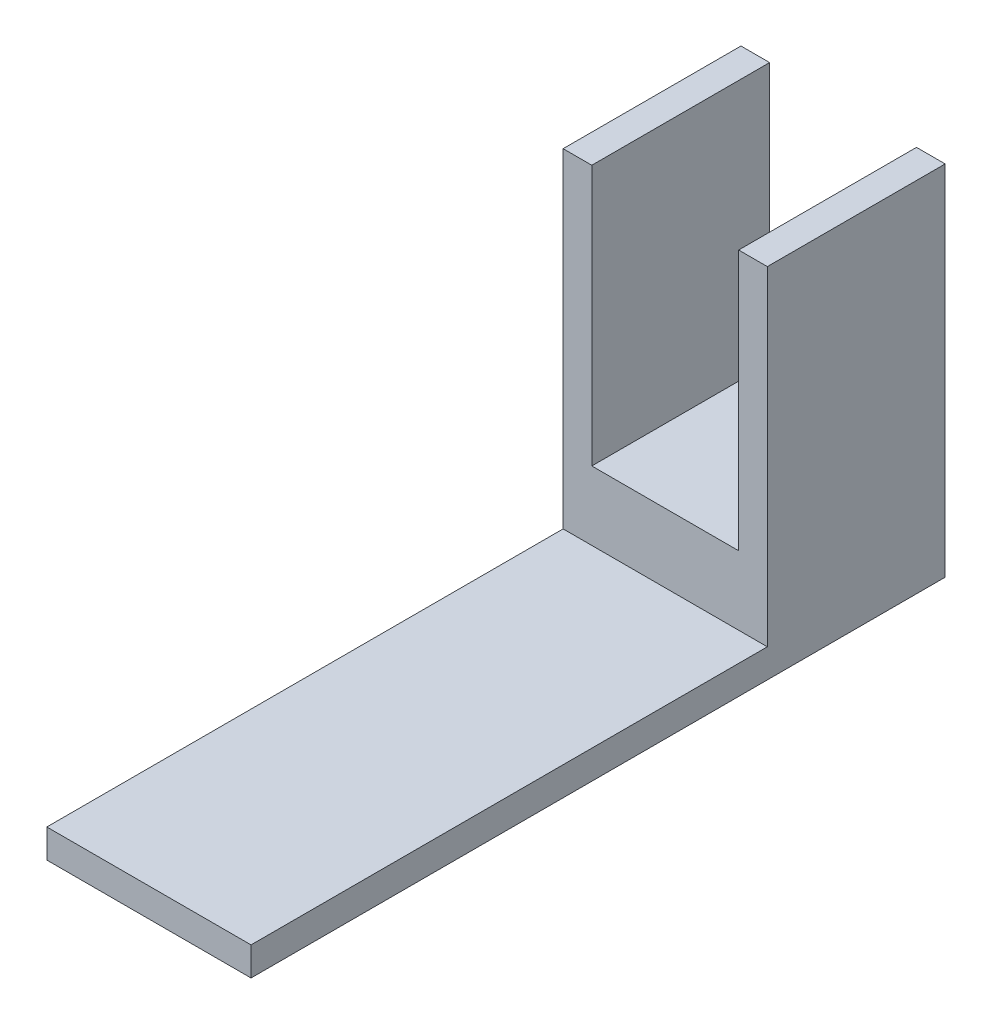
ISO-10303-21;
HEADER;
FILE_DESCRIPTION(('STEP AP214'),'2;1');
FILE_NAME('part.step','',(''),(''),'','','');
FILE_SCHEMA(('AUTOMOTIVE_DESIGN { 1 0 10303 214 1 1 1 1 }'));
ENDSEC;
DATA;
#1=APPLICATION_CONTEXT('core data for automotive mechanical design processes');
#2=APPLICATION_PROTOCOL_DEFINITION('international standard','automotive_design',2000,#1);
#3=PRODUCT_CONTEXT('',#1,'mechanical');
#4=PRODUCT('Part','Part','',(#3));
#5=PRODUCT_RELATED_PRODUCT_CATEGORY('part','',(#4));
#6=PRODUCT_DEFINITION_FORMATION('','',#4);
#7=PRODUCT_DEFINITION_CONTEXT('part definition',#1,'design');
#8=PRODUCT_DEFINITION('design','',#6,#7);
#9=PRODUCT_DEFINITION_SHAPE('','',#8);
#10=(LENGTH_UNIT() NAMED_UNIT(*) SI_UNIT(.MILLI.,.METRE.));
#11=(NAMED_UNIT(*) PLANE_ANGLE_UNIT() SI_UNIT($,.RADIAN.));
#12=(NAMED_UNIT(*) SI_UNIT($,.STERADIAN.) SOLID_ANGLE_UNIT());
#13=UNCERTAINTY_MEASURE_WITH_UNIT(LENGTH_MEASURE(1.E-05),#10,'distance_accuracy_value','');
#14=(GEOMETRIC_REPRESENTATION_CONTEXT(3) GLOBAL_UNCERTAINTY_ASSIGNED_CONTEXT((#13)) GLOBAL_UNIT_ASSIGNED_CONTEXT((#10,
#11,#12)) REPRESENTATION_CONTEXT('',''));
#15=CARTESIAN_POINT('',(0.,0.,0.));
#16=DIRECTION('',(0.,0.,1.));
#17=DIRECTION('',(1.,0.,0.));
#18=AXIS2_PLACEMENT_3D('',#15,#16,#17);
#19=CARTESIAN_POINT('',(0.,-4.,-15.5));
#20=DIRECTION('',(0.,0.,-1.));
#21=DIRECTION('',(-1.,0.,0.));
#22=AXIS2_PLACEMENT_3D('',#19,#20,#21);
#23=PLANE('',#22);
#24=DIRECTION('',(0.,1.,0.));
#25=VECTOR('',#24,1.);
#26=CARTESIAN_POINT('',(15.3,0.,-15.5));
#27=LINE('',#26,#25);
#28=CARTESIAN_POINT('',(15.3,-6.5,-15.5));
#29=VERTEX_POINT('',#28);
#30=CARTESIAN_POINT('',(15.3,24.7,-15.5));
#31=VERTEX_POINT('',#30);
#32=EDGE_CURVE('E235',#29,#31,#27,.T.);
#33=ORIENTED_EDGE('',*,*,#32,.F.);
#34=DIRECTION('',(1.,0.,0.));
#35=VECTOR('',#34,1.);
#36=CARTESIAN_POINT('',(15.3,-6.5,-15.5));
#37=LINE('',#36,#35);
#38=CARTESIAN_POINT('',(-2.49999999999999,-6.5,-15.5));
#39=VERTEX_POINT('',#38);
#40=EDGE_CURVE('E139',#39,#29,#37,.T.);
#41=ORIENTED_EDGE('',*,*,#40,.F.);
#42=DIRECTION('',(0.,-1.,0.));
#43=VECTOR('',#42,1.);
#44=CARTESIAN_POINT('',(-2.5,0.,-15.5));
#45=LINE('',#44,#43);
#46=CARTESIAN_POINT('',(-2.5,24.7,-15.5));
#47=VERTEX_POINT('',#46);
#48=EDGE_CURVE('E178',#47,#39,#45,.T.);
#49=ORIENTED_EDGE('',*,*,#48,.F.);
#50=DIRECTION('',(1.,0.,0.));
#51=VECTOR('',#50,1.);
#52=CARTESIAN_POINT('',(-2.5,24.7,-15.5));
#53=LINE('',#52,#51);
#54=CARTESIAN_POINT('',(0.,24.7,-15.5));
#55=VERTEX_POINT('',#54);
#56=EDGE_CURVE('E244',#47,#55,#53,.T.);
#57=ORIENTED_EDGE('',*,*,#56,.T.);
#58=DIRECTION('',(0.,-1.,0.));
#59=VECTOR('',#58,1.);
#60=CARTESIAN_POINT('',(0.,0.,-15.5));
#61=LINE('',#60,#59);
#62=CARTESIAN_POINT('',(0.,2.,-15.5));
#63=VERTEX_POINT('',#62);
#64=EDGE_CURVE('E177',#55,#63,#61,.T.);
#65=ORIENTED_EDGE('',*,*,#64,.T.);
#66=DIRECTION('',(-1.,0.,0.));
#67=VECTOR('',#66,1.);
#68=CARTESIAN_POINT('',(0.,2.,-15.5));
#69=LINE('',#68,#67);
#70=CARTESIAN_POINT('',(12.8,2.,-15.5));
#71=VERTEX_POINT('',#70);
#72=EDGE_CURVE('E49',#71,#63,#69,.T.);
#73=ORIENTED_EDGE('',*,*,#72,.F.);
#74=DIRECTION('',(0.,1.,0.));
#75=VECTOR('',#74,1.);
#76=CARTESIAN_POINT('',(12.8,0.,-15.5));
#77=LINE('',#76,#75);
#78=CARTESIAN_POINT('',(12.8,24.7,-15.5));
#79=VERTEX_POINT('',#78);
#80=EDGE_CURVE('E59',#71,#79,#77,.T.);
#81=ORIENTED_EDGE('',*,*,#80,.T.);
#82=DIRECTION('',(-1.,0.,0.));
#83=VECTOR('',#82,1.);
#84=CARTESIAN_POINT('',(15.3,24.7,-15.5));
#85=LINE('',#84,#83);
#86=EDGE_CURVE('E212',#31,#79,#85,.T.);
#87=ORIENTED_EDGE('',*,*,#86,.F.);
#88=EDGE_LOOP('',(#33,#41,#49,#57,#65,#73,#81,#87));
#89=FACE_BOUND('',#88,.T.);
#90=ADVANCED_FACE('F40',(#89),#23,.T.);
#91=CARTESIAN_POINT('',(0.,-4.,0.));
#92=DIRECTION('',(0.,0.,1.));
#93=DIRECTION('',(1.,0.,0.));
#94=AXIS2_PLACEMENT_3D('',#91,#92,#93);
#95=PLANE('',#94);
#96=DIRECTION('',(1.,0.,0.));
#97=VECTOR('',#96,1.);
#98=CARTESIAN_POINT('',(0.,-4.,0.));
#99=LINE('',#98,#97);
#100=CARTESIAN_POINT('',(-2.49999999999999,-4.,0.));
#101=VERTEX_POINT('',#100);
#102=CARTESIAN_POINT('',(15.3,-4.,0.));
#103=VERTEX_POINT('',#102);
#104=EDGE_CURVE('E11',#101,#103,#99,.T.);
#105=ORIENTED_EDGE('',*,*,#104,.T.);
#106=DIRECTION('',(0.,-1.,0.));
#107=VECTOR('',#106,1.);
#108=CARTESIAN_POINT('',(15.3,0.,0.));
#109=LINE('',#108,#107);
#110=CARTESIAN_POINT('',(15.3,24.7,0.));
#111=VERTEX_POINT('',#110);
#112=EDGE_CURVE('E184',#111,#103,#109,.T.);
#113=ORIENTED_EDGE('',*,*,#112,.F.);
#114=DIRECTION('',(-1.,0.,0.));
#115=VECTOR('',#114,1.);
#116=CARTESIAN_POINT('',(15.3,24.7,0.));
#117=LINE('',#116,#115);
#118=CARTESIAN_POINT('',(12.8,24.7,0.));
#119=VERTEX_POINT('',#118);
#120=EDGE_CURVE('E186',#111,#119,#117,.T.);
#121=ORIENTED_EDGE('',*,*,#120,.T.);
#122=DIRECTION('',(0.,-1.,0.));
#123=VECTOR('',#122,1.);
#124=CARTESIAN_POINT('',(12.8,0.,0.));
#125=LINE('',#124,#123);
#126=CARTESIAN_POINT('',(12.8,2.,0.));
#127=VERTEX_POINT('',#126);
#128=EDGE_CURVE('E226',#119,#127,#125,.T.);
#129=ORIENTED_EDGE('',*,*,#128,.T.);
#130=DIRECTION('',(1.,0.,0.));
#131=VECTOR('',#130,1.);
#132=CARTESIAN_POINT('',(0.,2.,0.));
#133=LINE('',#132,#131);
#134=CARTESIAN_POINT('',(0.,2.,0.));
#135=VERTEX_POINT('',#134);
#136=EDGE_CURVE('E200',#135,#127,#133,.T.);
#137=ORIENTED_EDGE('',*,*,#136,.F.);
#138=DIRECTION('',(0.,1.,0.));
#139=VECTOR('',#138,1.);
#140=CARTESIAN_POINT('',(0.,0.,0.));
#141=LINE('',#140,#139);
#142=CARTESIAN_POINT('',(0.,24.7,0.));
#143=VERTEX_POINT('',#142);
#144=EDGE_CURVE('E67',#135,#143,#141,.T.);
#145=ORIENTED_EDGE('',*,*,#144,.T.);
#146=DIRECTION('',(1.,0.,0.));
#147=VECTOR('',#146,1.);
#148=CARTESIAN_POINT('',(-2.5,24.7,0.));
#149=LINE('',#148,#147);
#150=CARTESIAN_POINT('',(-2.5,24.7,0.));
#151=VERTEX_POINT('',#150);
#152=EDGE_CURVE('E174',#151,#143,#149,.T.);
#153=ORIENTED_EDGE('',*,*,#152,.F.);
#154=DIRECTION('',(0.,1.,0.));
#155=VECTOR('',#154,1.);
#156=CARTESIAN_POINT('',(-2.5,0.,0.));
#157=LINE('',#156,#155);
#158=EDGE_CURVE('E168',#101,#151,#157,.T.);
#159=ORIENTED_EDGE('',*,*,#158,.F.);
#160=EDGE_LOOP('',(#105,#113,#121,#129,#137,#145,#153,#159));
#161=FACE_BOUND('',#160,.T.);
#162=ADVANCED_FACE('F42',(#161),#95,.T.);
#163=CARTESIAN_POINT('',(0.,2.,0.));
#164=DIRECTION('',(0.,-1.,0.));
#165=DIRECTION('',(0.,0.,-1.));
#166=AXIS2_PLACEMENT_3D('',#163,#164,#165);
#167=PLANE('',#166);
#168=DIRECTION('',(0.,0.,1.));
#169=VECTOR('',#168,1.);
#170=CARTESIAN_POINT('',(0.,2.,0.));
#171=LINE('',#170,#169);
#172=EDGE_CURVE('E190',#63,#135,#171,.T.);
#173=ORIENTED_EDGE('',*,*,#172,.T.);
#174=ORIENTED_EDGE('',*,*,#136,.T.);
#175=DIRECTION('',(0.,0.,-1.));
#176=VECTOR('',#175,1.);
#177=CARTESIAN_POINT('',(12.8,2.,0.));
#178=LINE('',#177,#176);
#179=EDGE_CURVE('E197',#127,#71,#178,.T.);
#180=ORIENTED_EDGE('',*,*,#179,.T.);
#181=ORIENTED_EDGE('',*,*,#72,.T.);
#182=EDGE_LOOP('',(#173,#174,#180,#181));
#183=FACE_BOUND('',#182,.T.);
#184=ADVANCED_FACE('F254',(#183),#167,.F.);
#185=CARTESIAN_POINT('',(15.3,24.7,0.));
#186=DIRECTION('',(0.,1.,0.));
#187=DIRECTION('',(0.,0.,1.));
#188=AXIS2_PLACEMENT_3D('',#185,#186,#187);
#189=PLANE('',#188);
#190=DIRECTION('',(0.,0.,-1.));
#191=VECTOR('',#190,1.);
#192=CARTESIAN_POINT('',(12.8,24.7,0.));
#193=LINE('',#192,#191);
#194=EDGE_CURVE('E225',#119,#79,#193,.T.);
#195=ORIENTED_EDGE('',*,*,#194,.F.);
#196=ORIENTED_EDGE('',*,*,#120,.F.);
#197=DIRECTION('',(0.,0.,-1.));
#198=VECTOR('',#197,1.);
#199=CARTESIAN_POINT('',(15.3,24.7,0.));
#200=LINE('',#199,#198);
#201=EDGE_CURVE('E187',#111,#31,#200,.T.);
#202=ORIENTED_EDGE('',*,*,#201,.T.);
#203=ORIENTED_EDGE('',*,*,#86,.T.);
#204=EDGE_LOOP('',(#195,#196,#202,#203));
#205=FACE_BOUND('',#204,.T.);
#206=ADVANCED_FACE('F256',(#205),#189,.T.);
#207=CARTESIAN_POINT('',(15.3,0.,0.));
#208=DIRECTION('',(1.,0.,0.));
#209=DIRECTION('',(0.,0.,-1.));
#210=AXIS2_PLACEMENT_3D('',#207,#208,#209);
#211=PLANE('',#210);
#212=ORIENTED_EDGE('',*,*,#32,.T.);
#213=ORIENTED_EDGE('',*,*,#201,.F.);
#214=ORIENTED_EDGE('',*,*,#112,.T.);
#215=DIRECTION('',(0.,0.,1.));
#216=VECTOR('',#215,1.);
#217=CARTESIAN_POINT('',(15.3,-4.,45.));
#218=LINE('',#217,#216);
#219=CARTESIAN_POINT('',(15.3,-4.,45.));
#220=VERTEX_POINT('',#219);
#221=EDGE_CURVE('E146',#103,#220,#218,.T.);
#222=ORIENTED_EDGE('',*,*,#221,.T.);
#223=DIRECTION('',(0.,1.,0.));
#224=VECTOR('',#223,1.);
#225=CARTESIAN_POINT('',(15.3,-6.5,45.));
#226=LINE('',#225,#224);
#227=CARTESIAN_POINT('',(15.3,-6.5,45.));
#228=VERTEX_POINT('',#227);
#229=EDGE_CURVE('E126',#228,#220,#226,.T.);
#230=ORIENTED_EDGE('',*,*,#229,.F.);
#231=DIRECTION('',(0.,0.,1.));
#232=VECTOR('',#231,1.);
#233=CARTESIAN_POINT('',(15.3,-6.5,45.));
#234=LINE('',#233,#232);
#235=EDGE_CURVE('E133',#29,#228,#234,.T.);
#236=ORIENTED_EDGE('',*,*,#235,.F.);
#237=EDGE_LOOP('',(#212,#213,#214,#222,#230,#236));
#238=FACE_BOUND('',#237,.T.);
#239=ADVANCED_FACE('F144',(#238),#211,.T.);
#240=CARTESIAN_POINT('',(12.8,0.,0.));
#241=DIRECTION('',(1.,0.,0.));
#242=DIRECTION('',(0.,0.,-1.));
#243=AXIS2_PLACEMENT_3D('',#240,#241,#242);
#244=PLANE('',#243);
#245=ORIENTED_EDGE('',*,*,#179,.F.);
#246=ORIENTED_EDGE('',*,*,#128,.F.);
#247=ORIENTED_EDGE('',*,*,#194,.T.);
#248=ORIENTED_EDGE('',*,*,#80,.F.);
#249=EDGE_LOOP('',(#245,#246,#247,#248));
#250=FACE_BOUND('',#249,.T.);
#251=ADVANCED_FACE('F255',(#250),#244,.F.);
#252=CARTESIAN_POINT('',(-2.5,24.7,0.));
#253=DIRECTION('',(0.,-1.,0.));
#254=DIRECTION('',(0.,0.,-1.));
#255=AXIS2_PLACEMENT_3D('',#252,#253,#254);
#256=PLANE('',#255);
#257=DIRECTION('',(0.,0.,-1.));
#258=VECTOR('',#257,1.);
#259=CARTESIAN_POINT('',(0.,24.7,0.));
#260=LINE('',#259,#258);
#261=EDGE_CURVE('E149',#143,#55,#260,.T.);
#262=ORIENTED_EDGE('',*,*,#261,.T.);
#263=ORIENTED_EDGE('',*,*,#56,.F.);
#264=DIRECTION('',(0.,0.,-1.));
#265=VECTOR('',#264,1.);
#266=CARTESIAN_POINT('',(-2.5,24.7,0.));
#267=LINE('',#266,#265);
#268=EDGE_CURVE('E176',#151,#47,#267,.T.);
#269=ORIENTED_EDGE('',*,*,#268,.F.);
#270=ORIENTED_EDGE('',*,*,#152,.T.);
#271=EDGE_LOOP('',(#262,#263,#269,#270));
#272=FACE_BOUND('',#271,.T.);
#273=ADVANCED_FACE('F248',(#272),#256,.F.);
#274=CARTESIAN_POINT('',(-2.5,0.,0.));
#275=DIRECTION('',(-1.,0.,0.));
#276=DIRECTION('',(0.,0.,1.));
#277=AXIS2_PLACEMENT_3D('',#274,#275,#276);
#278=PLANE('',#277);
#279=ORIENTED_EDGE('',*,*,#158,.T.);
#280=ORIENTED_EDGE('',*,*,#268,.T.);
#281=ORIENTED_EDGE('',*,*,#48,.T.);
#282=DIRECTION('',(0.,0.,-1.));
#283=VECTOR('',#282,1.);
#284=CARTESIAN_POINT('',(-2.5,-6.5,45.));
#285=LINE('',#284,#283);
#286=CARTESIAN_POINT('',(-2.5,-6.5,45.));
#287=VERTEX_POINT('',#286);
#288=EDGE_CURVE('E132',#287,#39,#285,.T.);
#289=ORIENTED_EDGE('',*,*,#288,.F.);
#290=DIRECTION('',(0.,1.,0.));
#291=VECTOR('',#290,1.);
#292=CARTESIAN_POINT('',(-2.5,-6.5,45.));
#293=LINE('',#292,#291);
#294=CARTESIAN_POINT('',(-2.5,-4.,45.));
#295=VERTEX_POINT('',#294);
#296=EDGE_CURVE('E128',#287,#295,#293,.T.);
#297=ORIENTED_EDGE('',*,*,#296,.T.);
#298=DIRECTION('',(0.,0.,-1.));
#299=VECTOR('',#298,1.);
#300=CARTESIAN_POINT('',(-2.5,-4.,45.));
#301=LINE('',#300,#299);
#302=EDGE_CURVE('E142',#295,#101,#301,.T.);
#303=ORIENTED_EDGE('',*,*,#302,.T.);
#304=EDGE_LOOP('',(#279,#280,#281,#289,#297,#303));
#305=FACE_BOUND('',#304,.T.);
#306=ADVANCED_FACE('F167',(#305),#278,.T.);
#307=CARTESIAN_POINT('',(0.,0.,0.));
#308=DIRECTION('',(-1.,0.,0.));
#309=DIRECTION('',(0.,0.,1.));
#310=AXIS2_PLACEMENT_3D('',#307,#308,#309);
#311=PLANE('',#310);
#312=ORIENTED_EDGE('',*,*,#172,.F.);
#313=ORIENTED_EDGE('',*,*,#64,.F.);
#314=ORIENTED_EDGE('',*,*,#261,.F.);
#315=ORIENTED_EDGE('',*,*,#144,.F.);
#316=EDGE_LOOP('',(#312,#313,#314,#315));
#317=FACE_BOUND('',#316,.T.);
#318=ADVANCED_FACE('F250',(#317),#311,.F.);
#319=CARTESIAN_POINT('',(0.,-4.,0.));
#320=DIRECTION('',(0.,1.,0.));
#321=DIRECTION('',(0.,0.,1.));
#322=AXIS2_PLACEMENT_3D('',#319,#320,#321);
#323=PLANE('',#322);
#324=ORIENTED_EDGE('',*,*,#104,.F.);
#325=ORIENTED_EDGE('',*,*,#302,.F.);
#326=DIRECTION('',(-1.,0.,0.));
#327=VECTOR('',#326,1.);
#328=CARTESIAN_POINT('',(15.3,-4.,45.));
#329=LINE('',#328,#327);
#330=EDGE_CURVE('E156',#220,#295,#329,.T.);
#331=ORIENTED_EDGE('',*,*,#330,.F.);
#332=ORIENTED_EDGE('',*,*,#221,.F.);
#333=EDGE_LOOP('',(#324,#325,#331,#332));
#334=FACE_BOUND('',#333,.T.);
#335=ADVANCED_FACE('F303',(#334),#323,.T.);
#336=CARTESIAN_POINT('',(15.3,-6.5,45.));
#337=DIRECTION('',(0.,0.,-1.));
#338=DIRECTION('',(-1.,0.,0.));
#339=AXIS2_PLACEMENT_3D('',#336,#337,#338);
#340=PLANE('',#339);
#341=ORIENTED_EDGE('',*,*,#330,.T.);
#342=ORIENTED_EDGE('',*,*,#296,.F.);
#343=DIRECTION('',(-1.,0.,0.));
#344=VECTOR('',#343,1.);
#345=CARTESIAN_POINT('',(15.3,-6.5,45.));
#346=LINE('',#345,#344);
#347=EDGE_CURVE('E122',#228,#287,#346,.T.);
#348=ORIENTED_EDGE('',*,*,#347,.F.);
#349=ORIENTED_EDGE('',*,*,#229,.T.);
#350=EDGE_LOOP('',(#341,#342,#348,#349));
#351=FACE_BOUND('',#350,.T.);
#352=ADVANCED_FACE('F124',(#351),#340,.F.);
#353=CARTESIAN_POINT('',(0.,-6.5,0.));
#354=DIRECTION('',(0.,1.,0.));
#355=DIRECTION('',(0.,0.,1.));
#356=AXIS2_PLACEMENT_3D('',#353,#354,#355);
#357=PLANE('',#356);
#358=ORIENTED_EDGE('',*,*,#235,.T.);
#359=ORIENTED_EDGE('',*,*,#347,.T.);
#360=ORIENTED_EDGE('',*,*,#288,.T.);
#361=ORIENTED_EDGE('',*,*,#40,.T.);
#362=EDGE_LOOP('',(#358,#359,#360,#361));
#363=FACE_BOUND('',#362,.T.);
#364=ADVANCED_FACE('F137',(#363),#357,.F.);
#365=CLOSED_SHELL('',(#90,#162,#184,#206,#239,#251,#273,#306,#318,#335,#352,#364));
#366=MANIFOLD_SOLID_BREP('B2',#365);
#367=ADVANCED_BREP_SHAPE_REPRESENTATION('',(#18,#366),#14);
#368=SHAPE_DEFINITION_REPRESENTATION(#9,#367);
ENDSEC;
END-ISO-10303-21;
